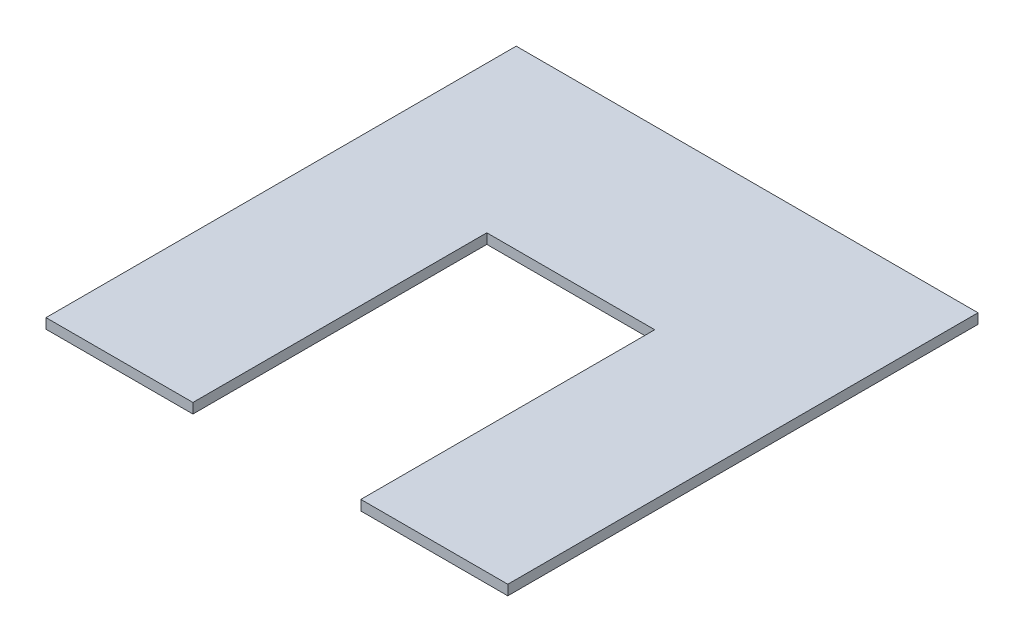
ISO-10303-21;
HEADER;
FILE_DESCRIPTION(('STEP AP214'),'2;1');
FILE_NAME('part.step','',(''),(''),'','','');
FILE_SCHEMA(('AUTOMOTIVE_DESIGN { 1 0 10303 214 1 1 1 1 }'));
ENDSEC;
DATA;
#1=APPLICATION_CONTEXT('core data for automotive mechanical design processes');
#2=APPLICATION_PROTOCOL_DEFINITION('international standard','automotive_design',2000,#1);
#3=PRODUCT_CONTEXT('',#1,'mechanical');
#4=PRODUCT('Part','Part','',(#3));
#5=PRODUCT_RELATED_PRODUCT_CATEGORY('part','',(#4));
#6=PRODUCT_DEFINITION_FORMATION('','',#4);
#7=PRODUCT_DEFINITION_CONTEXT('part definition',#1,'design');
#8=PRODUCT_DEFINITION('design','',#6,#7);
#9=PRODUCT_DEFINITION_SHAPE('','',#8);
#10=(LENGTH_UNIT() NAMED_UNIT(*) SI_UNIT(.MILLI.,.METRE.));
#11=(NAMED_UNIT(*) PLANE_ANGLE_UNIT() SI_UNIT($,.RADIAN.));
#12=(NAMED_UNIT(*) SI_UNIT($,.STERADIAN.) SOLID_ANGLE_UNIT());
#13=UNCERTAINTY_MEASURE_WITH_UNIT(LENGTH_MEASURE(1.E-05),#10,'distance_accuracy_value','');
#14=(GEOMETRIC_REPRESENTATION_CONTEXT(3) GLOBAL_UNCERTAINTY_ASSIGNED_CONTEXT((#13)) GLOBAL_UNIT_ASSIGNED_CONTEXT((#10,
#11,#12)) REPRESENTATION_CONTEXT('',''));
#15=CARTESIAN_POINT('',(0.,0.,0.));
#16=DIRECTION('',(0.,0.,1.));
#17=DIRECTION('',(1.,0.,0.));
#18=AXIS2_PLACEMENT_3D('',#15,#16,#17);
#19=CARTESIAN_POINT('',(-18.369511404491,6.,0.));
#20=DIRECTION('',(-1.,0.,0.));
#21=DIRECTION('',(0.,0.,1.));
#22=AXIS2_PLACEMENT_3D('',#19,#20,#21);
#23=PLANE('',#22);
#24=DIRECTION('',(0.,0.,-1.));
#25=VECTOR('',#24,1.);
#26=CARTESIAN_POINT('',(-18.369511404491,0.,0.));
#27=LINE('',#26,#25);
#28=CARTESIAN_POINT('',(-18.369511404491,0.,238.602306437987));
#29=VERTEX_POINT('',#28);
#30=CARTESIAN_POINT('',(-18.369511404491,0.,63.6023064379875));
#31=VERTEX_POINT('',#30);
#32=EDGE_CURVE('E137',#29,#31,#27,.T.);
#33=ORIENTED_EDGE('',*,*,#32,.T.);
#34=DIRECTION('',(0.,-1.,0.));
#35=VECTOR('',#34,1.);
#36=CARTESIAN_POINT('',(-18.369511404491,6.,63.6023064379875));
#37=LINE('',#36,#35);
#38=CARTESIAN_POINT('',(-18.369511404491,6.,63.6023064379875));
#39=VERTEX_POINT('',#38);
#40=EDGE_CURVE('E11',#39,#31,#37,.T.);
#41=ORIENTED_EDGE('',*,*,#40,.F.);
#42=DIRECTION('',(0.,0.,-1.));
#43=VECTOR('',#42,1.);
#44=CARTESIAN_POINT('',(-18.369511404491,6.,0.));
#45=LINE('',#44,#43);
#46=CARTESIAN_POINT('',(-18.369511404491,6.,238.602306437987));
#47=VERTEX_POINT('',#46);
#48=EDGE_CURVE('E155',#47,#39,#45,.T.);
#49=ORIENTED_EDGE('',*,*,#48,.F.);
#50=DIRECTION('',(0.,-1.,0.));
#51=VECTOR('',#50,1.);
#52=CARTESIAN_POINT('',(-18.369511404491,6.,238.602306437987));
#53=LINE('',#52,#51);
#54=EDGE_CURVE('E136',#47,#29,#53,.T.);
#55=ORIENTED_EDGE('',*,*,#54,.T.);
#56=EDGE_LOOP('',(#33,#41,#49,#55));
#57=FACE_BOUND('',#56,.T.);
#58=ADVANCED_FACE('F39',(#57),#23,.F.);
#59=CARTESIAN_POINT('',(0.,6.,63.6023064379875));
#60=DIRECTION('',(0.,0.,-1.));
#61=DIRECTION('',(-1.,0.,0.));
#62=AXIS2_PLACEMENT_3D('',#59,#60,#61);
#63=PLANE('',#62);
#64=DIRECTION('',(1.,0.,0.));
#65=VECTOR('',#64,1.);
#66=CARTESIAN_POINT('',(0.,0.,63.6023064379875));
#67=LINE('',#66,#65);
#68=CARTESIAN_POINT('',(81.630488595509,0.,63.6023064379875));
#69=VERTEX_POINT('',#68);
#70=EDGE_CURVE('E140',#31,#69,#67,.T.);
#71=ORIENTED_EDGE('',*,*,#70,.T.);
#72=DIRECTION('',(0.,-1.,0.));
#73=VECTOR('',#72,1.);
#74=CARTESIAN_POINT('',(81.630488595509,6.,63.6023064379875));
#75=LINE('',#74,#73);
#76=CARTESIAN_POINT('',(81.630488595509,6.,63.6023064379875));
#77=VERTEX_POINT('',#76);
#78=EDGE_CURVE('E47',#77,#69,#75,.T.);
#79=ORIENTED_EDGE('',*,*,#78,.F.);
#80=DIRECTION('',(1.,0.,0.));
#81=VECTOR('',#80,1.);
#82=CARTESIAN_POINT('',(0.,6.,63.6023064379875));
#83=LINE('',#82,#81);
#84=EDGE_CURVE('E97',#39,#77,#83,.T.);
#85=ORIENTED_EDGE('',*,*,#84,.F.);
#86=ORIENTED_EDGE('',*,*,#40,.T.);
#87=EDGE_LOOP('',(#71,#79,#85,#86));
#88=FACE_BOUND('',#87,.T.);
#89=ADVANCED_FACE('F168',(#88),#63,.F.);
#90=CARTESIAN_POINT('',(81.630488595509,6.,0.));
#91=DIRECTION('',(-1.,0.,0.));
#92=DIRECTION('',(0.,0.,1.));
#93=AXIS2_PLACEMENT_3D('',#90,#91,#92);
#94=PLANE('',#93);
#95=DIRECTION('',(0.,0.,-1.));
#96=VECTOR('',#95,1.);
#97=CARTESIAN_POINT('',(81.630488595509,0.,0.));
#98=LINE('',#97,#96);
#99=CARTESIAN_POINT('',(81.630488595509,0.,238.602306437987));
#100=VERTEX_POINT('',#99);
#101=EDGE_CURVE('E143',#100,#69,#98,.T.);
#102=ORIENTED_EDGE('',*,*,#101,.F.);
#103=DIRECTION('',(0.,-1.,0.));
#104=VECTOR('',#103,1.);
#105=CARTESIAN_POINT('',(81.630488595509,6.,238.602306437987));
#106=LINE('',#105,#104);
#107=CARTESIAN_POINT('',(81.630488595509,6.,238.602306437987));
#108=VERTEX_POINT('',#107);
#109=EDGE_CURVE('E161',#108,#100,#106,.T.);
#110=ORIENTED_EDGE('',*,*,#109,.F.);
#111=DIRECTION('',(0.,0.,-1.));
#112=VECTOR('',#111,1.);
#113=CARTESIAN_POINT('',(81.630488595509,6.,0.));
#114=LINE('',#113,#112);
#115=EDGE_CURVE('E167',#108,#77,#114,.T.);
#116=ORIENTED_EDGE('',*,*,#115,.T.);
#117=ORIENTED_EDGE('',*,*,#78,.T.);
#118=EDGE_LOOP('',(#102,#110,#116,#117));
#119=FACE_BOUND('',#118,.T.);
#120=ADVANCED_FACE('F165',(#119),#94,.T.);
#121=CARTESIAN_POINT('',(0.,6.,238.602306437987));
#122=DIRECTION('',(0.,0.,1.));
#123=DIRECTION('',(1.,0.,0.));
#124=AXIS2_PLACEMENT_3D('',#121,#122,#123);
#125=PLANE('',#124);
#126=DIRECTION('',(-1.,0.,0.));
#127=VECTOR('',#126,1.);
#128=CARTESIAN_POINT('',(0.,0.,238.602306437987));
#129=LINE('',#128,#127);
#130=CARTESIAN_POINT('',(169.130488595509,0.,238.602306437987));
#131=VERTEX_POINT('',#130);
#132=EDGE_CURVE('E146',#131,#100,#129,.T.);
#133=ORIENTED_EDGE('',*,*,#132,.F.);
#134=DIRECTION('',(0.,-1.,0.));
#135=VECTOR('',#134,1.);
#136=CARTESIAN_POINT('',(169.130488595509,6.,238.602306437987));
#137=LINE('',#136,#135);
#138=CARTESIAN_POINT('',(169.130488595509,6.,238.602306437987));
#139=VERTEX_POINT('',#138);
#140=EDGE_CURVE('E159',#139,#131,#137,.T.);
#141=ORIENTED_EDGE('',*,*,#140,.F.);
#142=DIRECTION('',(-1.,0.,0.));
#143=VECTOR('',#142,1.);
#144=CARTESIAN_POINT('',(0.,6.,238.602306437987));
#145=LINE('',#144,#143);
#146=EDGE_CURVE('E131',#139,#108,#145,.T.);
#147=ORIENTED_EDGE('',*,*,#146,.T.);
#148=ORIENTED_EDGE('',*,*,#109,.T.);
#149=EDGE_LOOP('',(#133,#141,#147,#148));
#150=FACE_BOUND('',#149,.T.);
#151=ADVANCED_FACE('F176',(#150),#125,.T.);
#152=CARTESIAN_POINT('',(169.130488595509,6.,0.));
#153=DIRECTION('',(1.,0.,0.));
#154=DIRECTION('',(0.,0.,-1.));
#155=AXIS2_PLACEMENT_3D('',#152,#153,#154);
#156=PLANE('',#155);
#157=DIRECTION('',(0.,0.,1.));
#158=VECTOR('',#157,1.);
#159=CARTESIAN_POINT('',(169.130488595509,0.,0.));
#160=LINE('',#159,#158);
#161=CARTESIAN_POINT('',(169.130488595509,0.,-41.3976935620125));
#162=VERTEX_POINT('',#161);
#163=EDGE_CURVE('E149',#162,#131,#160,.T.);
#164=ORIENTED_EDGE('',*,*,#163,.F.);
#165=DIRECTION('',(0.,-1.,0.));
#166=VECTOR('',#165,1.);
#167=CARTESIAN_POINT('',(169.130488595509,6.,-41.3976935620125));
#168=LINE('',#167,#166);
#169=CARTESIAN_POINT('',(169.130488595509,6.,-41.3976935620125));
#170=VERTEX_POINT('',#169);
#171=EDGE_CURVE('E119',#170,#162,#168,.T.);
#172=ORIENTED_EDGE('',*,*,#171,.F.);
#173=DIRECTION('',(0.,0.,1.));
#174=VECTOR('',#173,1.);
#175=CARTESIAN_POINT('',(169.130488595509,6.,0.));
#176=LINE('',#175,#174);
#177=EDGE_CURVE('E129',#170,#139,#176,.T.);
#178=ORIENTED_EDGE('',*,*,#177,.T.);
#179=ORIENTED_EDGE('',*,*,#140,.T.);
#180=EDGE_LOOP('',(#164,#172,#178,#179));
#181=FACE_BOUND('',#180,.T.);
#182=ADVANCED_FACE('F204',(#181),#156,.T.);
#183=CARTESIAN_POINT('',(0.,6.,-41.3976935620125));
#184=DIRECTION('',(0.,0.,-1.));
#185=DIRECTION('',(-1.,0.,0.));
#186=AXIS2_PLACEMENT_3D('',#183,#184,#185);
#187=PLANE('',#186);
#188=DIRECTION('',(1.,0.,0.));
#189=VECTOR('',#188,1.);
#190=CARTESIAN_POINT('',(0.,0.,-41.3976935620125));
#191=LINE('',#190,#189);
#192=CARTESIAN_POINT('',(-105.869511404491,0.,-41.3976935620125));
#193=VERTEX_POINT('',#192);
#194=EDGE_CURVE('E118',#193,#162,#191,.T.);
#195=ORIENTED_EDGE('',*,*,#194,.F.);
#196=DIRECTION('',(0.,-1.,0.));
#197=VECTOR('',#196,1.);
#198=CARTESIAN_POINT('',(-105.869511404491,6.,-41.3976935620125));
#199=LINE('',#198,#197);
#200=CARTESIAN_POINT('',(-105.869511404491,6.,-41.3976935620125));
#201=VERTEX_POINT('',#200);
#202=EDGE_CURVE('E112',#201,#193,#199,.T.);
#203=ORIENTED_EDGE('',*,*,#202,.F.);
#204=DIRECTION('',(1.,0.,0.));
#205=VECTOR('',#204,1.);
#206=CARTESIAN_POINT('',(0.,6.,-41.3976935620125));
#207=LINE('',#206,#205);
#208=EDGE_CURVE('E116',#201,#170,#207,.T.);
#209=ORIENTED_EDGE('',*,*,#208,.T.);
#210=ORIENTED_EDGE('',*,*,#171,.T.);
#211=EDGE_LOOP('',(#195,#203,#209,#210));
#212=FACE_BOUND('',#211,.T.);
#213=ADVANCED_FACE('F114',(#212),#187,.T.);
#214=CARTESIAN_POINT('',(-105.869511404491,6.,0.));
#215=DIRECTION('',(1.,0.,0.));
#216=DIRECTION('',(0.,0.,-1.));
#217=AXIS2_PLACEMENT_3D('',#214,#215,#216);
#218=PLANE('',#217);
#219=DIRECTION('',(0.,0.,1.));
#220=VECTOR('',#219,1.);
#221=CARTESIAN_POINT('',(-105.869511404491,0.,0.));
#222=LINE('',#221,#220);
#223=CARTESIAN_POINT('',(-105.869511404491,0.,238.602306437987));
#224=VERTEX_POINT('',#223);
#225=EDGE_CURVE('E83',#193,#224,#222,.T.);
#226=ORIENTED_EDGE('',*,*,#225,.T.);
#227=DIRECTION('',(0.,-1.,0.));
#228=VECTOR('',#227,1.);
#229=CARTESIAN_POINT('',(-105.869511404491,6.,238.602306437987));
#230=LINE('',#229,#228);
#231=CARTESIAN_POINT('',(-105.869511404491,6.,238.602306437987));
#232=VERTEX_POINT('',#231);
#233=EDGE_CURVE('E120',#232,#224,#230,.T.);
#234=ORIENTED_EDGE('',*,*,#233,.F.);
#235=DIRECTION('',(0.,0.,1.));
#236=VECTOR('',#235,1.);
#237=CARTESIAN_POINT('',(-105.869511404491,6.,0.));
#238=LINE('',#237,#236);
#239=EDGE_CURVE('E122',#201,#232,#238,.T.);
#240=ORIENTED_EDGE('',*,*,#239,.F.);
#241=ORIENTED_EDGE('',*,*,#202,.T.);
#242=EDGE_LOOP('',(#226,#234,#240,#241));
#243=FACE_BOUND('',#242,.T.);
#244=ADVANCED_FACE('F123',(#243),#218,.F.);
#245=CARTESIAN_POINT('',(0.,6.,238.602306437987));
#246=DIRECTION('',(0.,0.,-1.));
#247=DIRECTION('',(-1.,0.,0.));
#248=AXIS2_PLACEMENT_3D('',#245,#246,#247);
#249=PLANE('',#248);
#250=DIRECTION('',(1.,0.,0.));
#251=VECTOR('',#250,1.);
#252=CARTESIAN_POINT('',(0.,0.,238.602306437987));
#253=LINE('',#252,#251);
#254=EDGE_CURVE('E89',#224,#29,#253,.T.);
#255=ORIENTED_EDGE('',*,*,#254,.T.);
#256=ORIENTED_EDGE('',*,*,#54,.F.);
#257=DIRECTION('',(1.,0.,0.));
#258=VECTOR('',#257,1.);
#259=CARTESIAN_POINT('',(0.,6.,238.602306437987));
#260=LINE('',#259,#258);
#261=EDGE_CURVE('E55',#232,#47,#260,.T.);
#262=ORIENTED_EDGE('',*,*,#261,.F.);
#263=ORIENTED_EDGE('',*,*,#233,.T.);
#264=EDGE_LOOP('',(#255,#256,#262,#263));
#265=FACE_BOUND('',#264,.T.);
#266=ADVANCED_FACE('F183',(#265),#249,.F.);
#267=CARTESIAN_POINT('',(0.,6.,0.));
#268=DIRECTION('',(0.,1.,0.));
#269=DIRECTION('',(0.,0.,1.));
#270=AXIS2_PLACEMENT_3D('',#267,#268,#269);
#271=PLANE('',#270);
#272=ORIENTED_EDGE('',*,*,#48,.T.);
#273=ORIENTED_EDGE('',*,*,#84,.T.);
#274=ORIENTED_EDGE('',*,*,#115,.F.);
#275=ORIENTED_EDGE('',*,*,#146,.F.);
#276=ORIENTED_EDGE('',*,*,#177,.F.);
#277=ORIENTED_EDGE('',*,*,#208,.F.);
#278=ORIENTED_EDGE('',*,*,#239,.T.);
#279=ORIENTED_EDGE('',*,*,#261,.T.);
#280=EDGE_LOOP('',(#272,#273,#274,#275,#276,#277,#278,#279));
#281=FACE_BOUND('',#280,.T.);
#282=ADVANCED_FACE('F126',(#281),#271,.T.);
#283=CARTESIAN_POINT('',(0.,0.,0.));
#284=DIRECTION('',(0.,1.,0.));
#285=DIRECTION('',(0.,0.,1.));
#286=AXIS2_PLACEMENT_3D('',#283,#284,#285);
#287=PLANE('',#286);
#288=ORIENTED_EDGE('',*,*,#32,.F.);
#289=ORIENTED_EDGE('',*,*,#254,.F.);
#290=ORIENTED_EDGE('',*,*,#225,.F.);
#291=ORIENTED_EDGE('',*,*,#194,.T.);
#292=ORIENTED_EDGE('',*,*,#163,.T.);
#293=ORIENTED_EDGE('',*,*,#132,.T.);
#294=ORIENTED_EDGE('',*,*,#101,.T.);
#295=ORIENTED_EDGE('',*,*,#70,.F.);
#296=EDGE_LOOP('',(#288,#289,#290,#291,#292,#293,#294,#295));
#297=FACE_BOUND('',#296,.T.);
#298=ADVANCED_FACE('F172',(#297),#287,.F.);
#299=CLOSED_SHELL('',(#58,#89,#120,#151,#182,#213,#244,#266,#282,#298));
#300=MANIFOLD_SOLID_BREP('B2',#299);
#301=ADVANCED_BREP_SHAPE_REPRESENTATION('',(#18,#300),#14);
#302=SHAPE_DEFINITION_REPRESENTATION(#9,#301);
ENDSEC;
END-ISO-10303-21;
